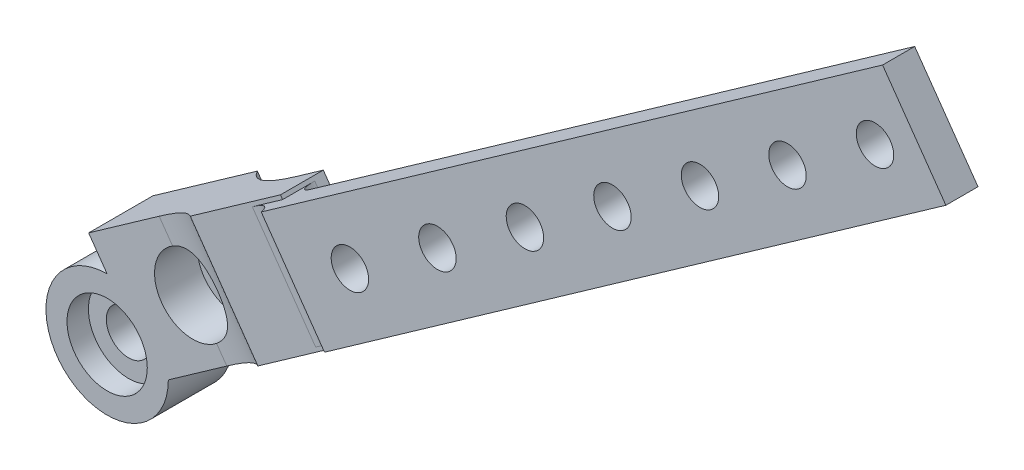
ISO-10303-21;
HEADER;
FILE_DESCRIPTION(('STEP AP214'),'2;1');
FILE_NAME('part.step','',(''),(''),'','','');
FILE_SCHEMA(('AUTOMOTIVE_DESIGN { 1 0 10303 214 1 1 1 1 }'));
ENDSEC;
DATA;
#1=APPLICATION_CONTEXT('core data for automotive mechanical design processes');
#2=APPLICATION_PROTOCOL_DEFINITION('international standard','automotive_design',2000,#1);
#3=PRODUCT_CONTEXT('',#1,'mechanical');
#4=PRODUCT('Part','Part','',(#3));
#5=PRODUCT_RELATED_PRODUCT_CATEGORY('part','',(#4));
#6=PRODUCT_DEFINITION_FORMATION('','',#4);
#7=PRODUCT_DEFINITION_CONTEXT('part definition',#1,'design');
#8=PRODUCT_DEFINITION('design','',#6,#7);
#9=PRODUCT_DEFINITION_SHAPE('','',#8);
#10=(LENGTH_UNIT() NAMED_UNIT(*) SI_UNIT(.MILLI.,.METRE.));
#11=(NAMED_UNIT(*) PLANE_ANGLE_UNIT() SI_UNIT($,.RADIAN.));
#12=(NAMED_UNIT(*) SI_UNIT($,.STERADIAN.) SOLID_ANGLE_UNIT());
#13=UNCERTAINTY_MEASURE_WITH_UNIT(LENGTH_MEASURE(1.E-05),#10,'distance_accuracy_value','');
#14=(GEOMETRIC_REPRESENTATION_CONTEXT(3) GLOBAL_UNCERTAINTY_ASSIGNED_CONTEXT((#13)) GLOBAL_UNIT_ASSIGNED_CONTEXT((#10,
#11,#12)) REPRESENTATION_CONTEXT('',''));
#15=CARTESIAN_POINT('',(0.,0.,0.));
#16=DIRECTION('',(0.,0.,1.));
#17=DIRECTION('',(1.,0.,0.));
#18=AXIS2_PLACEMENT_3D('',#15,#16,#17);
#19=CARTESIAN_POINT('',(0.,0.,3.));
#20=DIRECTION('',(0.,0.,1.));
#21=DIRECTION('',(1.,0.,0.));
#22=AXIS2_PLACEMENT_3D('',#19,#20,#21);
#23=PLANE('',#22);
#24=CARTESIAN_POINT('',(26.6749948851273,21.4820498186249,3.));
#25=DIRECTION('',(0.,0.,1.));
#26=DIRECTION('',(1.,0.,0.));
#27=AXIS2_PLACEMENT_3D('',#24,#25,#26);
#28=CIRCLE('',#27,1.75);
#29=CARTESIAN_POINT('',(28.4249948851273,21.4820498186249,3.));
#30=VERTEX_POINT('',#29);
#31=EDGE_CURVE('E328',#30,#30,#28,.T.);
#32=ORIENTED_EDGE('',*,*,#31,.T.);
#33=EDGE_LOOP('',(#32));
#34=FACE_BOUND('',#33,.T.);
#35=CARTESIAN_POINT('',(34.8489332584846,27.2428424262925,3.));
#36=DIRECTION('',(0.,0.,1.));
#37=DIRECTION('',(1.,0.,0.));
#38=AXIS2_PLACEMENT_3D('',#35,#36,#37);
#39=CIRCLE('',#38,1.75);
#40=CARTESIAN_POINT('',(36.5989332584846,27.2428424262925,3.));
#41=VERTEX_POINT('',#40);
#42=EDGE_CURVE('E333',#41,#41,#39,.T.);
#43=ORIENTED_EDGE('',*,*,#42,.T.);
#44=EDGE_LOOP('',(#43));
#45=FACE_BOUND('',#44,.T.);
#46=CARTESIAN_POINT('',(43.0228716318418,33.00363503396,3.));
#47=DIRECTION('',(0.,0.,1.));
#48=DIRECTION('',(1.,0.,0.));
#49=AXIS2_PLACEMENT_3D('',#46,#47,#48);
#50=CIRCLE('',#49,1.75);
#51=CARTESIAN_POINT('',(44.7728716318419,33.00363503396,3.));
#52=VERTEX_POINT('',#51);
#53=EDGE_CURVE('E335',#52,#52,#50,.T.);
#54=ORIENTED_EDGE('',*,*,#53,.T.);
#55=EDGE_LOOP('',(#54));
#56=FACE_BOUND('',#55,.T.);
#57=CARTESIAN_POINT('',(51.1968100051991,38.7644276416276,3.));
#58=DIRECTION('',(0.,0.,1.));
#59=DIRECTION('',(1.,0.,0.));
#60=AXIS2_PLACEMENT_3D('',#57,#58,#59);
#61=CIRCLE('',#60,1.75);
#62=CARTESIAN_POINT('',(52.9468100051991,38.7644276416276,3.));
#63=VERTEX_POINT('',#62);
#64=EDGE_CURVE('E340',#63,#63,#61,.T.);
#65=ORIENTED_EDGE('',*,*,#64,.T.);
#66=EDGE_LOOP('',(#65));
#67=FACE_BOUND('',#66,.T.);
#68=CARTESIAN_POINT('',(59.3707483785564,44.5252202492952,3.));
#69=DIRECTION('',(0.,0.,1.));
#70=DIRECTION('',(1.,0.,0.));
#71=AXIS2_PLACEMENT_3D('',#68,#69,#70);
#72=CIRCLE('',#71,1.75);
#73=CARTESIAN_POINT('',(61.1207483785564,44.5252202492952,3.));
#74=VERTEX_POINT('',#73);
#75=EDGE_CURVE('E337',#74,#74,#72,.T.);
#76=ORIENTED_EDGE('',*,*,#75,.T.);
#77=EDGE_LOOP('',(#76));
#78=FACE_BOUND('',#77,.T.);
#79=CARTESIAN_POINT('',(67.5446867519137,50.2860128569627,3.));
#80=DIRECTION('',(0.,0.,1.));
#81=DIRECTION('',(1.,0.,0.));
#82=AXIS2_PLACEMENT_3D('',#79,#80,#81);
#83=CIRCLE('',#82,1.75000000000001);
#84=CARTESIAN_POINT('',(69.2946867519137,50.2860128569627,3.));
#85=VERTEX_POINT('',#84);
#86=EDGE_CURVE('E343',#85,#85,#83,.T.);
#87=ORIENTED_EDGE('',*,*,#86,.T.);
#88=EDGE_LOOP('',(#87));
#89=FACE_BOUND('',#88,.T.);
#90=CARTESIAN_POINT('',(75.718625125271,56.0468054646303,3.));
#91=DIRECTION('',(0.,0.,1.));
#92=DIRECTION('',(1.,0.,0.));
#93=AXIS2_PLACEMENT_3D('',#90,#91,#92);
#94=CIRCLE('',#93,1.75000000000001);
#95=CARTESIAN_POINT('',(77.468625125271,56.0468054646303,3.));
#96=VERTEX_POINT('',#95);
#97=EDGE_CURVE('E346',#96,#96,#94,.T.);
#98=ORIENTED_EDGE('',*,*,#97,.T.);
#99=EDGE_LOOP('',(#98));
#100=FACE_BOUND('',#99,.T.);
#101=DIRECTION('',(-0.81737705829948,-0.576103067658634,0.));
#102=VECTOR('',#101,1.);
#103=CARTESIAN_POINT('',(1.695174232095,-2.40511916169124,3.));
#104=LINE('',#103,#102);
#105=CARTESIAN_POINT('',(82.3379002181802,54.4334247553516,3.));
#106=VERTEX_POINT('',#105);
#107=CARTESIAN_POINT('',(25.938883195516,14.6823130869058,3.));
#108=VERTEX_POINT('',#107);
#109=EDGE_CURVE('E321',#106,#108,#104,.T.);
#110=ORIENTED_EDGE('',*,*,#109,.T.);
#111=DIRECTION('',(0.576103067658632,-0.817377058299481,0.));
#112=VECTOR('',#111,1.);
#113=CARTESIAN_POINT('',(24.243708963421,17.087432248597,3.));
#114=LINE('',#113,#112);
#115=CARTESIAN_POINT('',(20.0258347020298,23.0717670830992,3.));
#116=VERTEX_POINT('',#115);
#117=EDGE_CURVE('E374',#108,#116,#114,.F.);
#118=ORIENTED_EDGE('',*,*,#117,.T.);
#119=DIRECTION('',(0.817377058299481,0.576103067658633,0.));
#120=VECTOR('',#119,1.);
#121=CARTESIAN_POINT('',(-4.21787426139126,5.98433483450211,3.));
#122=LINE('',#121,#120);
#123=CARTESIAN_POINT('',(76.424851724694,62.8228787515448,3.));
#124=VERTEX_POINT('',#123);
#125=EDGE_CURVE('E324',#116,#124,#122,.T.);
#126=ORIENTED_EDGE('',*,*,#125,.T.);
#127=DIRECTION('',(-0.576103067658632,0.817377058299481,0.));
#128=VECTOR('',#127,1.);
#129=CARTESIAN_POINT('',(82.5395362918607,54.1473427849467,3.));
#130=LINE('',#129,#128);
#131=EDGE_CURVE('E347',#106,#124,#130,.T.);
#132=ORIENTED_EDGE('',*,*,#131,.F.);
#133=EDGE_LOOP('',(#110,#118,#126,#132));
#134=FACE_BOUND('',#133,.T.);
#135=ADVANCED_FACE('F44',(#34,#45,#56,#67,#78,#89,#100,#134),#23,.F.);
#136=CARTESIAN_POINT('',(80.6427259860853,56.8385439170427,3.));
#137=DIRECTION('',(0.817377058299481,0.576103067658632,0.));
#138=DIRECTION('',(-0.576103067658632,0.817377058299481,0.));
#139=AXIS2_PLACEMENT_3D('',#136,#137,#138);
#140=PLANE('',#139);
#141=ORIENTED_EDGE('',*,*,#131,.T.);
#142=DIRECTION('',(0.,0.,1.));
#143=VECTOR('',#142,1.);
#144=CARTESIAN_POINT('',(76.424851724694,62.8228787515448,-5.));
#145=LINE('',#144,#143);
#146=CARTESIAN_POINT('',(76.424851724694,62.8228787515448,6.));
#147=VERTEX_POINT('',#146);
#148=EDGE_CURVE('E353',#124,#147,#145,.T.);
#149=ORIENTED_EDGE('',*,*,#148,.T.);
#150=DIRECTION('',(0.576103067658632,-0.817377058299481,0.));
#151=VECTOR('',#150,1.);
#152=CARTESIAN_POINT('',(76.424851724694,62.8228787515448,6.));
#153=LINE('',#152,#151);
#154=CARTESIAN_POINT('',(82.3379002181802,54.4334247553515,6.));
#155=VERTEX_POINT('',#154);
#156=EDGE_CURVE('E304',#147,#155,#153,.T.);
#157=ORIENTED_EDGE('',*,*,#156,.T.);
#158=DIRECTION('',(0.,0.,1.));
#159=VECTOR('',#158,1.);
#160=CARTESIAN_POINT('',(82.3379002181802,54.4334247553516,-5.));
#161=LINE('',#160,#159);
#162=EDGE_CURVE('E355',#106,#155,#161,.T.);
#163=ORIENTED_EDGE('',*,*,#162,.F.);
#164=EDGE_LOOP('',(#141,#149,#157,#163));
#165=FACE_BOUND('',#164,.T.);
#166=ADVANCED_FACE('F396',(#165),#140,.T.);
#167=CARTESIAN_POINT('',(82.3379002181802,54.4334247553516,-5.));
#168=DIRECTION('',(-0.576103067658634,0.81737705829948,0.));
#169=DIRECTION('',(-0.81737705829948,-0.576103067658634,0.));
#170=AXIS2_PLACEMENT_3D('',#167,#168,#169);
#171=PLANE('',#170);
#172=ORIENTED_EDGE('',*,*,#162,.T.);
#173=DIRECTION('',(0.817377058299481,0.576103067658632,0.));
#174=VECTOR('',#173,1.);
#175=CARTESIAN_POINT('',(22.6693749623181,12.3779008162713,6.));
#176=LINE('',#175,#174);
#177=CARTESIAN_POINT('',(24.304129078917,13.5301069515886,6.));
#178=VERTEX_POINT('',#177);
#179=EDGE_CURVE('E358',#178,#155,#176,.T.);
#180=ORIENTED_EDGE('',*,*,#179,.F.);
#181=CARTESIAN_POINT('',(21.4726518910853,11.5344273844265,8.));
#182=DIRECTION('',(-0.576103067658634,0.81737705829948,0.));
#183=DIRECTION('',(-0.81737705829948,-0.576103067658634,0.));
#184=AXIS2_PLACEMENT_3D('',#181,#182,#183);
#185=CIRCLE('',#184,4.);
#186=CARTESIAN_POINT('',(21.4726518910853,11.5344273844265,4.));
#187=VERTEX_POINT('',#186);
#188=EDGE_CURVE('E52',#178,#187,#185,.T.);
#189=ORIENTED_EDGE('',*,*,#188,.T.);
#190=DIRECTION('',(-0.81737705829948,-0.576103067658634,0.));
#191=VECTOR('',#190,1.);
#192=CARTESIAN_POINT('',(1.695174232095,-2.40511916169124,4.));
#193=LINE('',#192,#191);
#194=CARTESIAN_POINT('',(24.304129078917,13.5301069515886,4.));
#195=VERTEX_POINT('',#194);
#196=EDGE_CURVE('E58',#195,#187,#193,.T.);
#197=ORIENTED_EDGE('',*,*,#196,.F.);
#198=DIRECTION('',(0.,0.,1.));
#199=VECTOR('',#198,1.);
#200=CARTESIAN_POINT('',(24.304129078917,13.5301069515886,-5.));
#201=LINE('',#200,#199);
#202=CARTESIAN_POINT('',(24.304129078917,13.5301069515886,1.));
#203=VERTEX_POINT('',#202);
#204=EDGE_CURVE('E196',#203,#195,#201,.T.);
#205=ORIENTED_EDGE('',*,*,#204,.F.);
#206=CARTESIAN_POINT('',(25.938883195516,14.6823130869058,1.));
#207=DIRECTION('',(-0.576103067658634,0.81737705829948,0.));
#208=DIRECTION('',(-0.81737705829948,-0.576103067658634,0.));
#209=AXIS2_PLACEMENT_3D('',#206,#207,#208);
#210=CIRCLE('',#209,2.);
#211=EDGE_CURVE('E371',#203,#108,#210,.T.);
#212=ORIENTED_EDGE('',*,*,#211,.T.);
#213=ORIENTED_EDGE('',*,*,#109,.F.);
#214=EDGE_LOOP('',(#172,#180,#189,#197,#205,#212,#213));
#215=FACE_BOUND('',#214,.T.);
#216=ADVANCED_FACE('F484',(#215),#171,.F.);
#217=CARTESIAN_POINT('',(76.424851724694,62.8228787515448,-5.));
#218=DIRECTION('',(0.576103067658633,-0.817377058299481,0.));
#219=DIRECTION('',(0.817377058299481,0.576103067658633,0.));
#220=AXIS2_PLACEMENT_3D('',#217,#218,#219);
#221=PLANE('',#220);
#222=DIRECTION('',(0.,0.,1.));
#223=VECTOR('',#222,1.);
#224=CARTESIAN_POINT('',(18.3910805854308,21.9195609477819,-5.));
#225=LINE('',#224,#223);
#226=CARTESIAN_POINT('',(18.3910805854308,21.9195609477819,1.));
#227=VERTEX_POINT('',#226);
#228=CARTESIAN_POINT('',(18.3910805854308,21.9195609477819,4.));
#229=VERTEX_POINT('',#228);
#230=EDGE_CURVE('E357',#227,#229,#225,.T.);
#231=ORIENTED_EDGE('',*,*,#230,.T.);
#232=DIRECTION('',(0.817377058299481,0.576103067658633,0.));
#233=VECTOR('',#232,1.);
#234=CARTESIAN_POINT('',(-4.21787426139126,5.98433483450211,4.));
#235=LINE('',#234,#233);
#236=CARTESIAN_POINT('',(15.559603397599,19.9238813806198,4.));
#237=VERTEX_POINT('',#236);
#238=EDGE_CURVE('E376',#237,#229,#235,.T.);
#239=ORIENTED_EDGE('',*,*,#238,.F.);
#240=CARTESIAN_POINT('',(15.559603397599,19.9238813806198,8.));
#241=DIRECTION('',(0.576103067658633,-0.817377058299481,0.));
#242=DIRECTION('',(0.817377058299481,0.576103067658633,0.));
#243=AXIS2_PLACEMENT_3D('',#240,#241,#242);
#244=CIRCLE('',#243,4.);
#245=CARTESIAN_POINT('',(18.3910805854308,21.9195609477819,6.));
#246=VERTEX_POINT('',#245);
#247=EDGE_CURVE('E11',#237,#246,#244,.T.);
#248=ORIENTED_EDGE('',*,*,#247,.T.);
#249=DIRECTION('',(0.817377058299481,0.576103067658632,0.));
#250=VECTOR('',#249,1.);
#251=CARTESIAN_POINT('',(16.7563264688319,20.7673548124646,6.));
#252=LINE('',#251,#250);
#253=EDGE_CURVE('E360',#246,#147,#252,.T.);
#254=ORIENTED_EDGE('',*,*,#253,.T.);
#255=ORIENTED_EDGE('',*,*,#148,.F.);
#256=ORIENTED_EDGE('',*,*,#125,.F.);
#257=CARTESIAN_POINT('',(20.0258347020298,23.0717670830992,1.));
#258=DIRECTION('',(0.576103067658633,-0.817377058299481,0.));
#259=DIRECTION('',(0.817377058299481,0.576103067658633,0.));
#260=AXIS2_PLACEMENT_3D('',#257,#258,#259);
#261=CIRCLE('',#260,2.);
#262=EDGE_CURVE('E377',#116,#227,#261,.T.);
#263=ORIENTED_EDGE('',*,*,#262,.T.);
#264=EDGE_LOOP('',(#231,#239,#248,#254,#255,#256,#263));
#265=FACE_BOUND('',#264,.T.);
#266=ADVANCED_FACE('F391',(#265),#221,.F.);
#267=CARTESIAN_POINT('',(67.5446867519137,50.2860128569627,-65.));
#268=DIRECTION('',(0.,0.,1.));
#269=DIRECTION('',(1.,0.,0.));
#270=AXIS2_PLACEMENT_3D('',#267,#268,#269);
#271=CYLINDRICAL_SURFACE('',#270,1.75000000000001);
#272=ORIENTED_EDGE('',*,*,#86,.F.);
#273=EDGE_LOOP('',(#272));
#274=FACE_BOUND('',#273,.T.);
#275=CARTESIAN_POINT('',(67.5446867519137,50.2860128569627,6.));
#276=DIRECTION('',(0.,0.,1.));
#277=DIRECTION('',(0.,-1.,0.));
#278=AXIS2_PLACEMENT_3D('',#275,#276,#277);
#279=CIRCLE('',#278,1.75000000000001);
#280=CARTESIAN_POINT('',(67.5446867519137,48.5360128569627,6.));
#281=VERTEX_POINT('',#280);
#282=EDGE_CURVE('E320',#281,#281,#279,.T.);
#283=ORIENTED_EDGE('',*,*,#282,.T.);
#284=EDGE_LOOP('',(#283));
#285=FACE_BOUND('',#284,.T.);
#286=ADVANCED_FACE('F520',(#274,#285),#271,.F.);
#287=CARTESIAN_POINT('',(75.718625125271,56.0468054646303,-65.));
#288=DIRECTION('',(0.,0.,1.));
#289=DIRECTION('',(1.,0.,0.));
#290=AXIS2_PLACEMENT_3D('',#287,#288,#289);
#291=CYLINDRICAL_SURFACE('',#290,1.75000000000001);
#292=ORIENTED_EDGE('',*,*,#97,.F.);
#293=EDGE_LOOP('',(#292));
#294=FACE_BOUND('',#293,.T.);
#295=CARTESIAN_POINT('',(75.718625125271,56.0468054646303,6.));
#296=DIRECTION('',(0.,0.,1.));
#297=DIRECTION('',(0.,-1.,0.));
#298=AXIS2_PLACEMENT_3D('',#295,#296,#297);
#299=CIRCLE('',#298,1.75000000000001);
#300=CARTESIAN_POINT('',(75.718625125271,54.2968054646303,6.));
#301=VERTEX_POINT('',#300);
#302=EDGE_CURVE('E311',#301,#301,#299,.T.);
#303=ORIENTED_EDGE('',*,*,#302,.T.);
#304=EDGE_LOOP('',(#303));
#305=FACE_BOUND('',#304,.T.);
#306=ADVANCED_FACE('F548',(#294,#305),#291,.F.);
#307=CARTESIAN_POINT('',(59.3707483785564,44.5252202492952,-65.));
#308=DIRECTION('',(0.,0.,1.));
#309=DIRECTION('',(1.,0.,0.));
#310=AXIS2_PLACEMENT_3D('',#307,#308,#309);
#311=CYLINDRICAL_SURFACE('',#310,1.75);
#312=ORIENTED_EDGE('',*,*,#75,.F.);
#313=EDGE_LOOP('',(#312));
#314=FACE_BOUND('',#313,.T.);
#315=CARTESIAN_POINT('',(59.3707483785564,44.5252202492952,6.));
#316=DIRECTION('',(0.,0.,1.));
#317=DIRECTION('',(0.,-1.,0.));
#318=AXIS2_PLACEMENT_3D('',#315,#316,#317);
#319=CIRCLE('',#318,1.75);
#320=CARTESIAN_POINT('',(59.3707483785564,42.7752202492952,6.));
#321=VERTEX_POINT('',#320);
#322=EDGE_CURVE('E314',#321,#321,#319,.T.);
#323=ORIENTED_EDGE('',*,*,#322,.T.);
#324=EDGE_LOOP('',(#323));
#325=FACE_BOUND('',#324,.T.);
#326=ADVANCED_FACE('F542',(#314,#325),#311,.F.);
#327=CARTESIAN_POINT('',(51.1968100051991,38.7644276416276,-65.));
#328=DIRECTION('',(0.,0.,1.));
#329=DIRECTION('',(1.,0.,0.));
#330=AXIS2_PLACEMENT_3D('',#327,#328,#329);
#331=CYLINDRICAL_SURFACE('',#330,1.75);
#332=ORIENTED_EDGE('',*,*,#64,.F.);
#333=EDGE_LOOP('',(#332));
#334=FACE_BOUND('',#333,.T.);
#335=CARTESIAN_POINT('',(51.1968100051991,38.7644276416276,6.));
#336=DIRECTION('',(0.,0.,1.));
#337=DIRECTION('',(0.,-1.,0.));
#338=AXIS2_PLACEMENT_3D('',#335,#336,#337);
#339=CIRCLE('',#338,1.75);
#340=CARTESIAN_POINT('',(51.1968100051991,37.0144276416276,6.));
#341=VERTEX_POINT('',#340);
#342=EDGE_CURVE('E309',#341,#341,#339,.T.);
#343=ORIENTED_EDGE('',*,*,#342,.T.);
#344=EDGE_LOOP('',(#343));
#345=FACE_BOUND('',#344,.T.);
#346=ADVANCED_FACE('F546',(#334,#345),#331,.F.);
#347=CARTESIAN_POINT('',(43.0228716318418,33.00363503396,-65.));
#348=DIRECTION('',(0.,0.,1.));
#349=DIRECTION('',(1.,0.,0.));
#350=AXIS2_PLACEMENT_3D('',#347,#348,#349);
#351=CYLINDRICAL_SURFACE('',#350,1.75);
#352=ORIENTED_EDGE('',*,*,#53,.F.);
#353=EDGE_LOOP('',(#352));
#354=FACE_BOUND('',#353,.T.);
#355=CARTESIAN_POINT('',(43.0228716318418,33.00363503396,6.));
#356=DIRECTION('',(0.,0.,1.));
#357=DIRECTION('',(0.,-1.,0.));
#358=AXIS2_PLACEMENT_3D('',#355,#356,#357);
#359=CIRCLE('',#358,1.75);
#360=CARTESIAN_POINT('',(43.0228716318418,31.25363503396,6.));
#361=VERTEX_POINT('',#360);
#362=EDGE_CURVE('E307',#361,#361,#359,.T.);
#363=ORIENTED_EDGE('',*,*,#362,.T.);
#364=EDGE_LOOP('',(#363));
#365=FACE_BOUND('',#364,.T.);
#366=ADVANCED_FACE('F560',(#354,#365),#351,.F.);
#367=CARTESIAN_POINT('',(34.8489332584846,27.2428424262925,-65.));
#368=DIRECTION('',(0.,0.,1.));
#369=DIRECTION('',(1.,0.,0.));
#370=AXIS2_PLACEMENT_3D('',#367,#368,#369);
#371=CYLINDRICAL_SURFACE('',#370,1.75);
#372=ORIENTED_EDGE('',*,*,#42,.F.);
#373=EDGE_LOOP('',(#372));
#374=FACE_BOUND('',#373,.T.);
#375=CARTESIAN_POINT('',(34.8489332584846,27.2428424262925,6.));
#376=DIRECTION('',(0.,0.,1.));
#377=DIRECTION('',(0.,-1.,0.));
#378=AXIS2_PLACEMENT_3D('',#375,#376,#377);
#379=CIRCLE('',#378,1.75);
#380=CARTESIAN_POINT('',(34.8489332584846,25.4928424262925,6.));
#381=VERTEX_POINT('',#380);
#382=EDGE_CURVE('E305',#381,#381,#379,.T.);
#383=ORIENTED_EDGE('',*,*,#382,.T.);
#384=EDGE_LOOP('',(#383));
#385=FACE_BOUND('',#384,.T.);
#386=ADVANCED_FACE('F568',(#374,#385),#371,.F.);
#387=CARTESIAN_POINT('',(26.6749948851273,21.4820498186249,-65.));
#388=DIRECTION('',(0.,0.,1.));
#389=DIRECTION('',(1.,0.,0.));
#390=AXIS2_PLACEMENT_3D('',#387,#388,#389);
#391=CYLINDRICAL_SURFACE('',#390,1.75);
#392=ORIENTED_EDGE('',*,*,#31,.F.);
#393=EDGE_LOOP('',(#392));
#394=FACE_BOUND('',#393,.T.);
#395=CARTESIAN_POINT('',(26.6749948851273,21.4820498186249,6.));
#396=DIRECTION('',(0.,0.,1.));
#397=DIRECTION('',(0.,-1.,0.));
#398=AXIS2_PLACEMENT_3D('',#395,#396,#397);
#399=CIRCLE('',#398,1.75);
#400=CARTESIAN_POINT('',(26.6749948851273,19.7320498186249,6.));
#401=VERTEX_POINT('',#400);
#402=EDGE_CURVE('E296',#401,#401,#399,.T.);
#403=ORIENTED_EDGE('',*,*,#402,.T.);
#404=EDGE_LOOP('',(#403));
#405=FACE_BOUND('',#404,.T.);
#406=ADVANCED_FACE('F513',(#394,#405),#391,.F.);
#407=CARTESIAN_POINT('',(16.7563264688319,20.7673548124646,6.));
#408=DIRECTION('',(0.,0.,1.));
#409=DIRECTION('',(0.,-1.,0.));
#410=AXIS2_PLACEMENT_3D('',#407,#408,#409);
#411=PLANE('',#410);
#412=ORIENTED_EDGE('',*,*,#402,.F.);
#413=EDGE_LOOP('',(#412));
#414=FACE_BOUND('',#413,.T.);
#415=ORIENTED_EDGE('',*,*,#382,.F.);
#416=EDGE_LOOP('',(#415));
#417=FACE_BOUND('',#416,.T.);
#418=ORIENTED_EDGE('',*,*,#362,.F.);
#419=EDGE_LOOP('',(#418));
#420=FACE_BOUND('',#419,.T.);
#421=ORIENTED_EDGE('',*,*,#342,.F.);
#422=EDGE_LOOP('',(#421));
#423=FACE_BOUND('',#422,.T.);
#424=ORIENTED_EDGE('',*,*,#322,.F.);
#425=EDGE_LOOP('',(#424));
#426=FACE_BOUND('',#425,.T.);
#427=ORIENTED_EDGE('',*,*,#302,.F.);
#428=EDGE_LOOP('',(#427));
#429=FACE_BOUND('',#428,.T.);
#430=ORIENTED_EDGE('',*,*,#282,.F.);
#431=EDGE_LOOP('',(#430));
#432=FACE_BOUND('',#431,.T.);
#433=ORIENTED_EDGE('',*,*,#253,.F.);
#434=DIRECTION('',(0.576103067658632,-0.817377058299481,0.));
#435=VECTOR('',#434,1.);
#436=CARTESIAN_POINT('',(22.6089548468221,15.9352261132798,6.));
#437=LINE('',#436,#435);
#438=EDGE_CURVE('E323',#246,#178,#437,.T.);
#439=ORIENTED_EDGE('',*,*,#438,.T.);
#440=ORIENTED_EDGE('',*,*,#179,.T.);
#441=ORIENTED_EDGE('',*,*,#156,.F.);
#442=EDGE_LOOP('',(#433,#439,#440,#441));
#443=FACE_BOUND('',#442,.T.);
#444=ADVANCED_FACE('F397',(#414,#417,#420,#423,#426,#429,#432,#443),#411,.T.);
#445=CARTESIAN_POINT('',(22.6089548468221,15.9352261132798,0.));
#446=DIRECTION('',(0.817377058299481,0.576103067658632,0.));
#447=DIRECTION('',(-0.576103067658632,0.817377058299481,0.));
#448=AXIS2_PLACEMENT_3D('',#445,#446,#447);
#449=PLANE('',#448);
#450=DIRECTION('',(0.576103067658632,-0.817377058299481,0.));
#451=VECTOR('',#450,1.);
#452=CARTESIAN_POINT('',(22.6089548468221,15.9352261132798,1.));
#453=LINE('',#452,#451);
#454=EDGE_CURVE('E322',#227,#203,#453,.T.);
#455=ORIENTED_EDGE('',*,*,#454,.T.);
#456=ORIENTED_EDGE('',*,*,#204,.T.);
#457=DIRECTION('',(0.576103067658632,-0.817377058299481,0.));
#458=VECTOR('',#457,1.);
#459=CARTESIAN_POINT('',(24.5057651525976,13.2440249811838,4.));
#460=LINE('',#459,#458);
#461=CARTESIAN_POINT('',(24.5057651525976,13.2440249811838,4.));
#462=VERTEX_POINT('',#461);
#463=EDGE_CURVE('E207',#195,#462,#460,.T.);
#464=ORIENTED_EDGE('',*,*,#463,.T.);
#465=DIRECTION('',(0.,0.,-1.));
#466=VECTOR('',#465,1.);
#467=CARTESIAN_POINT('',(24.5057651525976,13.2440249811838,2.));
#468=LINE('',#467,#466);
#469=CARTESIAN_POINT('',(24.5057651525976,13.2440249811838,0.));
#470=VERTEX_POINT('',#469);
#471=EDGE_CURVE('E191',#462,#470,#468,.T.);
#472=ORIENTED_EDGE('',*,*,#471,.T.);
#473=DIRECTION('',(0.576103067658625,-0.817377058299486,0.));
#474=VECTOR('',#473,1.);
#475=CARTESIAN_POINT('',(22.6089548468222,15.9352261132796,0.));
#476=LINE('',#475,#474);
#477=CARTESIAN_POINT('',(18.1894445117503,22.2056429181867,0.));
#478=VERTEX_POINT('',#477);
#479=EDGE_CURVE('E181',#478,#470,#476,.T.);
#480=ORIENTED_EDGE('',*,*,#479,.F.);
#481=DIRECTION('',(0.,0.,1.));
#482=VECTOR('',#481,1.);
#483=CARTESIAN_POINT('',(18.1894445117503,22.2056429181867,2.));
#484=LINE('',#483,#482);
#485=CARTESIAN_POINT('',(18.1894445117503,22.2056429181867,4.));
#486=VERTEX_POINT('',#485);
#487=EDGE_CURVE('E186',#478,#486,#484,.T.);
#488=ORIENTED_EDGE('',*,*,#487,.T.);
#489=EDGE_CURVE('E410',#486,#229,#460,.T.);
#490=ORIENTED_EDGE('',*,*,#489,.T.);
#491=ORIENTED_EDGE('',*,*,#230,.F.);
#492=EDGE_LOOP('',(#455,#456,#464,#472,#480,#488,#490,#491));
#493=FACE_BOUND('',#492,.T.);
#494=ADVANCED_FACE('F188',(#493),#449,.T.);
#495=CARTESIAN_POINT('',(-1.72830920297589,8.16722711068241,2.));
#496=DIRECTION('',(0.576103067658631,-0.817377058299482,0.));
#497=DIRECTION('',(0.817377058299482,0.576103067658631,0.));
#498=AXIS2_PLACEMENT_3D('',#495,#496,#497);
#499=PLANE('',#498);
#500=ORIENTED_EDGE('',*,*,#487,.F.);
#501=DIRECTION('',(-0.817377058299482,-0.576103067658631,0.));
#502=VECTOR('',#501,1.);
#503=CARTESIAN_POINT('',(-1.72830920297589,8.16722711068241,0.));
#504=LINE('',#503,#502);
#505=CARTESIAN_POINT('',(15.6995592923545,20.4507239386939,0.));
#506=VERTEX_POINT('',#505);
#507=EDGE_CURVE('E205',#478,#506,#504,.T.);
#508=ORIENTED_EDGE('',*,*,#507,.T.);
#509=CARTESIAN_POINT('',(15.6995592923545,20.4507239386939,-13.));
#510=DIRECTION('',(0.576103067658631,-0.817377058299482,0.));
#511=DIRECTION('',(0.817377058299482,0.576103067658631,0.));
#512=AXIS2_PLACEMENT_3D('',#509,#510,#511);
#513=CIRCLE('',#512,13.);
#514=CARTESIAN_POINT('',(8.03188282042254,15.0463981230366,-4.));
#515=VERTEX_POINT('',#514);
#516=EDGE_CURVE('E214',#506,#515,#513,.T.);
#517=ORIENTED_EDGE('',*,*,#516,.T.);
#518=DIRECTION('',(0.817377058299483,0.576103067658629,0.));
#519=VECTOR('',#518,1.);
#520=CARTESIAN_POINT('',(-1.72830920297589,8.16722711068241,-4.));
#521=LINE('',#520,#519);
#522=CARTESIAN_POINT('',(-1.72830920297589,8.16722711068241,-4.));
#523=VERTEX_POINT('',#522);
#524=EDGE_CURVE('E267',#523,#515,#521,.T.);
#525=ORIENTED_EDGE('',*,*,#524,.F.);
#526=DIRECTION('',(0.,0.,-1.));
#527=VECTOR('',#526,1.);
#528=CARTESIAN_POINT('',(-1.72830920297589,8.16722711068241,2.));
#529=LINE('',#528,#527);
#530=CARTESIAN_POINT('',(-1.72830920297589,8.16722711068241,2.));
#531=VERTEX_POINT('',#530);
#532=EDGE_CURVE('E414',#531,#523,#529,.T.);
#533=ORIENTED_EDGE('',*,*,#532,.F.);
#534=DIRECTION('',(-0.817377058299482,-0.576103067658631,0.));
#535=VECTOR('',#534,1.);
#536=CARTESIAN_POINT('',(-1.72830920297589,8.16722711068241,2.));
#537=LINE('',#536,#535);
#538=CARTESIAN_POINT('',(4.85947159707791,12.8104216919806,2.));
#539=VERTEX_POINT('',#538);
#540=EDGE_CURVE('E227',#539,#531,#537,.T.);
#541=ORIENTED_EDGE('',*,*,#540,.F.);
#542=CARTESIAN_POINT('',(4.85947159707791,12.8104216919806,12.));
#543=DIRECTION('',(0.576103067658631,-0.817377058299482,0.));
#544=DIRECTION('',(0.817377058299482,0.576103067658631,0.));
#545=AXIS2_PLACEMENT_3D('',#542,#543,#544);
#546=CIRCLE('',#545,10.);
#547=CARTESIAN_POINT('',(9.76373394687481,16.2670400979324,4.));
#548=VERTEX_POINT('',#547);
#549=EDGE_CURVE('E211',#539,#548,#546,.T.);
#550=ORIENTED_EDGE('',*,*,#549,.T.);
#551=DIRECTION('',(-0.817377058299482,-0.576103067658631,0.));
#552=VECTOR('',#551,1.);
#553=CARTESIAN_POINT('',(9.76373394687481,16.2670400979324,4.));
#554=LINE('',#553,#552);
#555=EDGE_CURVE('E204',#486,#548,#554,.T.);
#556=ORIENTED_EDGE('',*,*,#555,.F.);
#557=EDGE_LOOP('',(#500,#508,#517,#525,#533,#541,#550,#556));
#558=FACE_BOUND('',#557,.T.);
#559=ADVANCED_FACE('F201',(#558),#499,.F.);
#560=CARTESIAN_POINT('',(15.3411111129398,6.78460059109725,2.));
#561=DIRECTION('',(-0.57610306765863,0.817377058299483,0.));
#562=DIRECTION('',(-0.817377058299483,-0.57610306765863,0.));
#563=AXIS2_PLACEMENT_3D('',#560,#561,#562);
#564=PLANE('',#563);
#565=DIRECTION('',(0.817377058299483,0.57610306765863,0.));
#566=VECTOR('',#565,1.);
#567=CARTESIAN_POINT('',(15.3411111129398,6.78460059109725,0.));
#568=LINE('',#567,#566);
#569=CARTESIAN_POINT('',(22.0158799332018,11.4891060016909,0.));
#570=VERTEX_POINT('',#569);
#571=EDGE_CURVE('E212',#570,#470,#568,.T.);
#572=ORIENTED_EDGE('',*,*,#571,.T.);
#573=ORIENTED_EDGE('',*,*,#471,.F.);
#574=DIRECTION('',(0.817377058299482,0.576103067658631,0.));
#575=VECTOR('',#574,1.);
#576=CARTESIAN_POINT('',(16.080054587722,7.30542216092946,4.));
#577=LINE('',#576,#575);
#578=CARTESIAN_POINT('',(16.080054587722,7.30542216092946,4.));
#579=VERTEX_POINT('',#578);
#580=EDGE_CURVE('E251',#579,#462,#577,.T.);
#581=ORIENTED_EDGE('',*,*,#580,.F.);
#582=CARTESIAN_POINT('',(11.1757922379251,3.84880375497767,12.));
#583=DIRECTION('',(-0.57610306765863,0.817377058299483,0.));
#584=DIRECTION('',(-0.817377058299483,-0.57610306765863,0.));
#585=AXIS2_PLACEMENT_3D('',#582,#583,#584);
#586=CIRCLE('',#585,10.);
#587=CARTESIAN_POINT('',(11.1757922379251,3.84880375497768,2.));
#588=VERTEX_POINT('',#587);
#589=EDGE_CURVE('E423',#579,#588,#586,.T.);
#590=ORIENTED_EDGE('',*,*,#589,.T.);
#591=DIRECTION('',(0.817377058299484,0.576103067658628,0.));
#592=VECTOR('',#591,1.);
#593=CARTESIAN_POINT('',(5.71509593578396,0.,2.));
#594=LINE('',#593,#592);
#595=CARTESIAN_POINT('',(5.71509593578396,0.,2.));
#596=VERTEX_POINT('',#595);
#597=EDGE_CURVE('E226',#596,#588,#594,.T.);
#598=ORIENTED_EDGE('',*,*,#597,.F.);
#599=DIRECTION('',(0.,0.,-1.));
#600=VECTOR('',#599,1.);
#601=CARTESIAN_POINT('',(5.71509593578396,0.,2.));
#602=LINE('',#601,#600);
#603=CARTESIAN_POINT('',(5.71509593578396,0.,-4.));
#604=VERTEX_POINT('',#603);
#605=EDGE_CURVE('E831',#596,#604,#602,.T.);
#606=ORIENTED_EDGE('',*,*,#605,.T.);
#607=DIRECTION('',(-0.817377058299483,-0.576103067658629,0.));
#608=VECTOR('',#607,1.);
#609=CARTESIAN_POINT('',(14.3482034612697,6.08478018603363,-4.));
#610=LINE('',#609,#608);
#611=CARTESIAN_POINT('',(14.3482034612697,6.08478018603363,-4.));
#612=VERTEX_POINT('',#611);
#613=EDGE_CURVE('E264',#612,#604,#610,.T.);
#614=ORIENTED_EDGE('',*,*,#613,.F.);
#615=CARTESIAN_POINT('',(22.0158799332018,11.4891060016909,-13.));
#616=DIRECTION('',(-0.57610306765863,0.817377058299483,0.));
#617=DIRECTION('',(-0.817377058299483,-0.57610306765863,0.));
#618=AXIS2_PLACEMENT_3D('',#615,#616,#617);
#619=CIRCLE('',#618,13.);
#620=EDGE_CURVE('E216',#612,#570,#619,.T.);
#621=ORIENTED_EDGE('',*,*,#620,.T.);
#622=EDGE_LOOP('',(#572,#573,#581,#590,#598,#606,#614,#621));
#623=FACE_BOUND('',#622,.T.);
#624=ADVANCED_FACE('F447',(#623),#564,.F.);
#625=CARTESIAN_POINT('',(0.,0.,0.));
#626=DIRECTION('',(0.,0.,1.));
#627=DIRECTION('',(1.,0.,0.));
#628=AXIS2_PLACEMENT_3D('',#625,#626,#627);
#629=PLANE('',#628);
#630=ORIENTED_EDGE('',*,*,#507,.F.);
#631=ORIENTED_EDGE('',*,*,#479,.T.);
#632=ORIENTED_EDGE('',*,*,#571,.F.);
#633=DIRECTION('',(-0.576103067658629,0.817377058299483,0.));
#634=VECTOR('',#633,1.);
#635=CARTESIAN_POINT('',(20.1190696274264,14.1803071337869,0.));
#636=LINE('',#635,#634);
#637=EDGE_CURVE('E213',#570,#506,#636,.T.);
#638=ORIENTED_EDGE('',*,*,#637,.T.);
#639=EDGE_LOOP('',(#630,#631,#632,#638));
#640=FACE_BOUND('',#639,.T.);
#641=ADVANCED_FACE('F206',(#640),#629,.F.);
#642=CARTESIAN_POINT('',(0.,0.,-2.));
#643=DIRECTION('',(0.,0.,1.));
#644=DIRECTION('',(1.,0.,0.));
#645=AXIS2_PLACEMENT_3D('',#642,#643,#644);
#646=CYLINDRICAL_SURFACE('',#645,2.075);
#647=CARTESIAN_POINT('',(0.,0.,-4.));
#648=DIRECTION('',(0.,0.,-1.));
#649=DIRECTION('',(-1.,0.,0.));
#650=AXIS2_PLACEMENT_3D('',#647,#648,#649);
#651=CIRCLE('',#650,2.075);
#652=CARTESIAN_POINT('',(-2.075,0.,-4.));
#653=VERTEX_POINT('',#652);
#654=EDGE_CURVE('E285',#653,#653,#651,.T.);
#655=ORIENTED_EDGE('',*,*,#654,.T.);
#656=EDGE_LOOP('',(#655));
#657=FACE_BOUND('',#656,.T.);
#658=CARTESIAN_POINT('',(0.,0.,0.));
#659=DIRECTION('',(0.,0.,1.));
#660=DIRECTION('',(1.,0.,0.));
#661=AXIS2_PLACEMENT_3D('',#658,#659,#660);
#662=CIRCLE('',#661,2.075);
#663=CARTESIAN_POINT('',(2.075,0.,0.));
#664=VERTEX_POINT('',#663);
#665=EDGE_CURVE('E297',#664,#664,#662,.F.);
#666=ORIENTED_EDGE('',*,*,#665,.F.);
#667=EDGE_LOOP('',(#666));
#668=FACE_BOUND('',#667,.T.);
#669=ADVANCED_FACE('F459',(#657,#668),#646,.F.);
#670=CARTESIAN_POINT('',(8.48528137423711,8.48528137423782,2.));
#671=DIRECTION('',(0.,0.,-1.));
#672=DIRECTION('',(-1.,0.,0.));
#673=AXIS2_PLACEMENT_3D('',#670,#671,#672);
#674=CYLINDRICAL_SURFACE('',#673,2.);
#675=DIRECTION('',(0.,0.,-1.));
#676=VECTOR('',#675,1.);
#677=CARTESIAN_POINT('',(9.89949493661021,7.07106781186472,2.));
#678=LINE('',#677,#676);
#679=CARTESIAN_POINT('',(9.89949493661021,7.07106781186472,-2.));
#680=VERTEX_POINT('',#679);
#681=CARTESIAN_POINT('',(9.89949493661021,7.07106781186472,-4.));
#682=VERTEX_POINT('',#681);
#683=EDGE_CURVE('E250',#680,#682,#678,.T.);
#684=ORIENTED_EDGE('',*,*,#683,.F.);
#685=CARTESIAN_POINT('',(8.48528137423711,8.48528137423782,-2.));
#686=DIRECTION('',(0.,0.,1.));
#687=DIRECTION('',(1.,0.,0.));
#688=AXIS2_PLACEMENT_3D('',#685,#686,#687);
#689=CIRCLE('',#688,2.);
#690=CARTESIAN_POINT('',(7.07106781186402,9.89949493661091,-2.));
#691=VERTEX_POINT('',#690);
#692=EDGE_CURVE('E240',#680,#691,#689,.T.);
#693=ORIENTED_EDGE('',*,*,#692,.T.);
#694=DIRECTION('',(0.,0.,-1.));
#695=VECTOR('',#694,1.);
#696=CARTESIAN_POINT('',(7.07106781186402,9.89949493661091,2.));
#697=LINE('',#696,#695);
#698=CARTESIAN_POINT('',(7.07106781186402,9.89949493661091,-4.));
#699=VERTEX_POINT('',#698);
#700=EDGE_CURVE('E238',#691,#699,#697,.T.);
#701=ORIENTED_EDGE('',*,*,#700,.T.);
#702=CARTESIAN_POINT('',(8.48528137423711,8.48528137423782,-4.));
#703=DIRECTION('',(0.,0.,-1.));
#704=DIRECTION('',(-1.,0.,0.));
#705=AXIS2_PLACEMENT_3D('',#702,#703,#704);
#706=CIRCLE('',#705,2.);
#707=EDGE_CURVE('E237',#699,#682,#706,.T.);
#708=ORIENTED_EDGE('',*,*,#707,.T.);
#709=EDGE_LOOP('',(#684,#693,#701,#708));
#710=FACE_BOUND('',#709,.T.);
#711=ADVANCED_FACE('F453',(#710),#674,.F.);
#712=CARTESIAN_POINT('',(7.07106781186402,9.89949493661091,2.));
#713=DIRECTION('',(0.707106781186564,-0.707106781186531,0.));
#714=DIRECTION('',(0.707106781186531,0.707106781186564,0.));
#715=AXIS2_PLACEMENT_3D('',#712,#713,#714);
#716=PLANE('',#715);
#717=ORIENTED_EDGE('',*,*,#700,.F.);
#718=DIRECTION('',(-0.707106781186531,-0.707106781186564,0.));
#719=VECTOR('',#718,1.);
#720=CARTESIAN_POINT('',(7.07106781186402,9.89949493661091,-2.));
#721=LINE('',#720,#719);
#722=CARTESIAN_POINT('',(6.58578643762543,9.4142135623723,-2.));
#723=VERTEX_POINT('',#722);
#724=EDGE_CURVE('E245',#691,#723,#721,.T.);
#725=ORIENTED_EDGE('',*,*,#724,.T.);
#726=DIRECTION('',(0.,0.,-1.));
#727=VECTOR('',#726,1.);
#728=CARTESIAN_POINT('',(6.58578643762543,9.4142135623723,2.));
#729=LINE('',#728,#727);
#730=CARTESIAN_POINT('',(6.58578643762543,9.4142135623723,-4.));
#731=VERTEX_POINT('',#730);
#732=EDGE_CURVE('E236',#723,#731,#729,.T.);
#733=ORIENTED_EDGE('',*,*,#732,.T.);
#734=DIRECTION('',(0.707106781186529,0.707106781186566,0.));
#735=VECTOR('',#734,1.);
#736=CARTESIAN_POINT('',(7.07106781186402,9.89949493661091,-4.));
#737=LINE('',#736,#735);
#738=EDGE_CURVE('E241',#731,#699,#737,.T.);
#739=ORIENTED_EDGE('',*,*,#738,.T.);
#740=EDGE_LOOP('',(#717,#725,#733,#739));
#741=FACE_BOUND('',#740,.T.);
#742=ADVANCED_FACE('F456',(#741),#716,.T.);
#743=CARTESIAN_POINT('',(7.99999999999854,7.99999999999922,2.));
#744=DIRECTION('',(0.,0.,-1.));
#745=DIRECTION('',(-1.,0.,0.));
#746=AXIS2_PLACEMENT_3D('',#743,#744,#745);
#747=CYLINDRICAL_SURFACE('',#746,1.99999999999999);
#748=ORIENTED_EDGE('',*,*,#732,.F.);
#749=CARTESIAN_POINT('',(7.99999999999854,7.99999999999922,-2.));
#750=DIRECTION('',(0.,0.,1.));
#751=DIRECTION('',(1.,0.,0.));
#752=AXIS2_PLACEMENT_3D('',#749,#750,#751);
#753=CIRCLE('',#752,1.99999999999999);
#754=CARTESIAN_POINT('',(9.41421356237164,6.58578643762615,-2.));
#755=VERTEX_POINT('',#754);
#756=EDGE_CURVE('E249',#723,#755,#753,.T.);
#757=ORIENTED_EDGE('',*,*,#756,.T.);
#758=DIRECTION('',(0.,0.,-1.));
#759=VECTOR('',#758,1.);
#760=CARTESIAN_POINT('',(9.41421356237164,6.58578643762615,2.));
#761=LINE('',#760,#759);
#762=CARTESIAN_POINT('',(9.41421356237164,6.58578643762615,-4.));
#763=VERTEX_POINT('',#762);
#764=EDGE_CURVE('E243',#755,#763,#761,.T.);
#765=ORIENTED_EDGE('',*,*,#764,.T.);
#766=CARTESIAN_POINT('',(7.99999999999854,7.99999999999922,-4.));
#767=DIRECTION('',(0.,0.,-1.));
#768=DIRECTION('',(-1.,0.,0.));
#769=AXIS2_PLACEMENT_3D('',#766,#767,#768);
#770=CIRCLE('',#769,1.99999999999999);
#771=EDGE_CURVE('E247',#763,#731,#770,.T.);
#772=ORIENTED_EDGE('',*,*,#771,.T.);
#773=EDGE_LOOP('',(#748,#757,#765,#772));
#774=FACE_BOUND('',#773,.T.);
#775=ADVANCED_FACE('F462',(#774),#747,.F.);
#776=CARTESIAN_POINT('',(9.41421356237164,6.58578643762615,2.));
#777=DIRECTION('',(-0.707106781186552,0.707106781186543,0.));
#778=DIRECTION('',(-0.707106781186543,-0.707106781186552,0.));
#779=AXIS2_PLACEMENT_3D('',#776,#777,#778);
#780=PLANE('',#779);
#781=ORIENTED_EDGE('',*,*,#764,.F.);
#782=DIRECTION('',(0.707106781186543,0.707106781186552,0.));
#783=VECTOR('',#782,1.);
#784=CARTESIAN_POINT('',(9.41421356237164,6.58578643762615,-2.));
#785=LINE('',#784,#783);
#786=EDGE_CURVE('E248',#755,#680,#785,.T.);
#787=ORIENTED_EDGE('',*,*,#786,.T.);
#788=ORIENTED_EDGE('',*,*,#683,.T.);
#789=DIRECTION('',(-0.70710678118654,-0.707106781186555,0.));
#790=VECTOR('',#789,1.);
#791=CARTESIAN_POINT('',(9.41421356237164,6.58578643762615,-4.));
#792=LINE('',#791,#790);
#793=EDGE_CURVE('E231',#682,#763,#792,.T.);
#794=ORIENTED_EDGE('',*,*,#793,.T.);
#795=EDGE_LOOP('',(#781,#787,#788,#794));
#796=FACE_BOUND('',#795,.T.);
#797=ADVANCED_FACE('F466',(#796),#780,.T.);
#798=CARTESIAN_POINT('',(0.,0.,2.));
#799=DIRECTION('',(0.,0.,1.));
#800=DIRECTION('',(1.,0.,0.));
#801=AXIS2_PLACEMENT_3D('',#798,#799,#800);
#802=PLANE('',#801);
#803=CARTESIAN_POINT('',(0.,0.,2.));
#804=DIRECTION('',(0.,0.,1.));
#805=DIRECTION('',(1.,0.,0.));
#806=AXIS2_PLACEMENT_3D('',#803,#804,#805);
#807=CIRCLE('',#806,3.75);
#808=CARTESIAN_POINT('',(3.75,0.,2.));
#809=VERTEX_POINT('',#808);
#810=EDGE_CURVE('E200',#809,#809,#807,.T.);
#811=ORIENTED_EDGE('',*,*,#810,.F.);
#812=EDGE_LOOP('',(#811));
#813=FACE_BOUND('',#812,.T.);
#814=ORIENTED_EDGE('',*,*,#597,.T.);
#815=DIRECTION('',(-0.576103067658631,0.817377058299482,0.));
#816=VECTOR('',#815,1.);
#817=CARTESIAN_POINT('',(4.85947159707791,12.8104216919806,2.));
#818=LINE('',#817,#816);
#819=CARTESIAN_POINT('',(10.2212076753053,5.20317168928392,2.));
#820=VERTEX_POINT('',#819);
#821=EDGE_CURVE('E235',#588,#820,#818,.T.);
#822=ORIENTED_EDGE('',*,*,#821,.T.);
#823=CARTESIAN_POINT('',(7.99999999999854,7.99999999999922,2.));
#824=DIRECTION('',(0.,0.,1.));
#825=DIRECTION('',(1.,0.,0.));
#826=AXIS2_PLACEMENT_3D('',#823,#824,#825);
#827=CIRCLE('',#826,3.57155598254602);
#828=CARTESIAN_POINT('',(6.11277721052296,11.0322272802908,2.));
#829=VERTEX_POINT('',#828);
#830=EDGE_CURVE('E425',#829,#820,#827,.T.);
#831=ORIENTED_EDGE('',*,*,#830,.F.);
#832=DIRECTION('',(-0.576103067658631,0.817377058299482,0.));
#833=VECTOR('',#832,1.);
#834=CARTESIAN_POINT('',(4.85947159707791,12.8104216919806,2.));
#835=LINE('',#834,#833);
#836=EDGE_CURVE('E229',#829,#539,#835,.T.);
#837=ORIENTED_EDGE('',*,*,#836,.T.);
#838=ORIENTED_EDGE('',*,*,#540,.T.);
#839=DIRECTION('',(0.576103067658629,-0.817377058299484,0.));
#840=VECTOR('',#839,1.);
#841=CARTESIAN_POINT('',(0.,5.71509593578396,2.));
#842=LINE('',#841,#840);
#843=CARTESIAN_POINT('',(0.,5.71509593578396,2.));
#844=VERTEX_POINT('',#843);
#845=EDGE_CURVE('E225',#531,#844,#842,.T.);
#846=ORIENTED_EDGE('',*,*,#845,.T.);
#847=CARTESIAN_POINT('',(0.,0.,2.));
#848=DIRECTION('',(0.,0.,1.));
#849=DIRECTION('',(1.,0.,0.));
#850=AXIS2_PLACEMENT_3D('',#847,#848,#849);
#851=CIRCLE('',#850,5.71509593578396);
#852=EDGE_CURVE('E223',#844,#596,#851,.T.);
#853=ORIENTED_EDGE('',*,*,#852,.T.);
#854=EDGE_LOOP('',(#814,#822,#831,#837,#838,#846,#853));
#855=FACE_BOUND('',#854,.T.);
#856=ADVANCED_FACE('F443',(#813,#855),#802,.T.);
#857=CARTESIAN_POINT('',(0.,0.,2.));
#858=DIRECTION('',(0.,0.,-1.));
#859=DIRECTION('',(-1.,0.,0.));
#860=AXIS2_PLACEMENT_3D('',#857,#858,#859);
#861=CYLINDRICAL_SURFACE('',#860,5.71509593578396);
#862=DIRECTION('',(0.,0.,-1.));
#863=VECTOR('',#862,1.);
#864=CARTESIAN_POINT('',(0.,5.71509593578396,2.));
#865=LINE('',#864,#863);
#866=CARTESIAN_POINT('',(0.,5.71509593578396,-4.));
#867=VERTEX_POINT('',#866);
#868=EDGE_CURVE('E217',#844,#867,#865,.T.);
#869=ORIENTED_EDGE('',*,*,#868,.T.);
#870=CARTESIAN_POINT('',(0.,0.,-4.));
#871=DIRECTION('',(0.,0.,-1.));
#872=DIRECTION('',(-1.,0.,0.));
#873=AXIS2_PLACEMENT_3D('',#870,#871,#872);
#874=CIRCLE('',#873,5.71509593578396);
#875=EDGE_CURVE('E259',#604,#867,#874,.T.);
#876=ORIENTED_EDGE('',*,*,#875,.F.);
#877=ORIENTED_EDGE('',*,*,#605,.F.);
#878=ORIENTED_EDGE('',*,*,#852,.F.);
#879=EDGE_LOOP('',(#869,#876,#877,#878));
#880=FACE_BOUND('',#879,.T.);
#881=ADVANCED_FACE('F436',(#880),#861,.T.);
#882=CARTESIAN_POINT('',(0.,5.71509593578396,2.));
#883=DIRECTION('',(0.817377058299484,0.576103067658629,0.));
#884=DIRECTION('',(-0.576103067658629,0.817377058299484,0.));
#885=AXIS2_PLACEMENT_3D('',#882,#883,#884);
#886=PLANE('',#885);
#887=ORIENTED_EDGE('',*,*,#532,.T.);
#888=DIRECTION('',(-0.576103067658629,0.817377058299484,0.));
#889=VECTOR('',#888,1.);
#890=CARTESIAN_POINT('',(0.,5.71509593578396,-4.));
#891=LINE('',#890,#889);
#892=EDGE_CURVE('E252',#867,#523,#891,.T.);
#893=ORIENTED_EDGE('',*,*,#892,.F.);
#894=ORIENTED_EDGE('',*,*,#868,.F.);
#895=ORIENTED_EDGE('',*,*,#845,.F.);
#896=EDGE_LOOP('',(#887,#893,#894,#895));
#897=FACE_BOUND('',#896,.T.);
#898=ADVANCED_FACE('F445',(#897),#886,.F.);
#899=CARTESIAN_POINT('',(7.99999999999854,7.99999999999922,4.));
#900=DIRECTION('',(0.,0.,-1.));
#901=DIRECTION('',(-1.,0.,0.));
#902=AXIS2_PLACEMENT_3D('',#899,#900,#901);
#903=CYLINDRICAL_SURFACE('',#902,3.57155598254602);
#904=ORIENTED_EDGE('',*,*,#830,.T.);
#905=CARTESIAN_POINT('',(10.2212076753053,5.20317168928392,2.));
#906=CARTESIAN_POINT('',(10.2975704292511,5.26380177288371,1.99998699508641));
#907=CARTESIAN_POINT('',(10.3714268277013,5.32757255473101,2.00142113954168));
#908=CARTESIAN_POINT('',(10.5136109917883,5.46085819392371,2.00704616676149));
#909=CARTESIAN_POINT('',(10.5819402592001,5.53037148052895,2.01123629785322));
#910=CARTESIAN_POINT('',(10.7124068246547,5.67442909023523,2.02221991885824));
#911=CARTESIAN_POINT('',(10.7745615173245,5.74895822694178,2.02900581809504));
#912=CARTESIAN_POINT('',(10.8924874050251,5.90263918607455,2.04495184749888));
#913=CARTESIAN_POINT('',(10.9482583572271,5.9817911841753,2.05411206793864));
#914=CARTESIAN_POINT('',(11.1053892888008,6.22523892780856,2.0847465227128));
#915=CARTESIAN_POINT('',(11.1967609700901,6.39574105955742,2.10939214904634));
#916=CARTESIAN_POINT('',(11.3506203025513,6.74841456100147,2.16437074601983));
#917=CARTESIAN_POINT('',(11.4130907026816,6.93059282646184,2.1947070982851));
#918=CARTESIAN_POINT('',(11.5096270973217,7.30870575231196,2.25892749480164));
#919=CARTESIAN_POINT('',(11.5426288198337,7.50489851482669,2.29289826653532));
#920=CARTESIAN_POINT('',(11.5756740851366,7.90028024572033,2.35962208069272));
#921=CARTESIAN_POINT('',(11.5757106700511,8.09946983776114,2.39237486457976));
#922=CARTESIAN_POINT('',(11.5421338476424,8.50083110867268,2.45357153361413));
#923=CARTESIAN_POINT('',(11.5076851299542,8.7029540761954,2.48188827836088));
#924=CARTESIAN_POINT('',(11.4043304891099,9.09929137295825,2.52945247787205));
#925=CARTESIAN_POINT('',(11.3354391798334,9.29350901863762,2.54870377235595));
#926=CARTESIAN_POINT('',(11.1683966443125,9.66017336550403,2.57486332755043));
#927=CARTESIAN_POINT('',(11.0715652721006,9.83318692754408,2.58224664461882));
#928=CARTESIAN_POINT('',(10.8505672037163,10.1608580763221,2.58515315835116));
#929=CARTESIAN_POINT('',(10.7264064277508,10.3155196273969,2.58067892133291));
#930=CARTESIAN_POINT('',(10.4601952440626,10.5960251842433,2.56091141135017));
#931=CARTESIAN_POINT('',(10.3190659853765,10.7227785014592,2.54606083033067));
#932=CARTESIAN_POINT('',(10.0193047827718,10.9519538824685,2.50785595088868));
#933=CARTESIAN_POINT('',(9.8606697090719,11.054371585059,2.48450013013259));
#934=CARTESIAN_POINT('',(9.5253889087594,11.2351978942678,2.4312277110094));
#935=CARTESIAN_POINT('',(9.3483613825953,11.3128478265064,2.40114464205601));
#936=CARTESIAN_POINT('',(8.98454990092712,11.4385648770185,2.33822421536398));
#937=CARTESIAN_POINT('',(8.79776382845515,11.4866255472012,2.3053862590507));
#938=CARTESIAN_POINT('',(8.40919314823958,11.5537862858013,2.23885149867287));
#939=CARTESIAN_POINT('',(8.2071271973616,11.5713036308707,2.20519489685636));
#940=CARTESIAN_POINT('',(7.80195566692059,11.5718025550426,2.14267229800309));
#941=CARTESIAN_POINT('',(7.59884964073445,11.5547677912753,2.11380857494549));
#942=CARTESIAN_POINT('',(7.29851701868026,11.503460573202,2.07682992891445));
#943=CARTESIAN_POINT('',(7.19931167505693,11.4821304828632,2.06557197504799));
#944=CARTESIAN_POINT('',(7.00286113899318,11.4310356494056,2.0454685264881));
#945=CARTESIAN_POINT('',(6.90561509555344,11.4012746566026,2.03662196256243));
#946=CARTESIAN_POINT('',(6.71403966621566,11.3335605387101,2.02165802818945));
#947=CARTESIAN_POINT('',(6.61970468000109,11.2956244311586,2.01553506814081));
#948=CARTESIAN_POINT('',(6.43453906373874,11.2117996860455,2.00621789431905));
#949=CARTESIAN_POINT('',(6.34370593993372,11.1659168403902,2.00302155809617));
#950=CARTESIAN_POINT('',(6.23097432881954,11.1027924323174,2.00090440784502));
#951=CARTESIAN_POINT('',(6.20709519734862,11.0890555562522,2.000565403829));
#952=CARTESIAN_POINT('',(6.15968153709757,11.0610450324153,2.00011335965361));
#953=CARTESIAN_POINT('',(6.13614670949311,11.046771893844,2.00000011039383));
#954=CARTESIAN_POINT('',(6.11277721052296,11.0322272802908,2.));
#955=B_SPLINE_CURVE_WITH_KNOTS('',3,(#905,#906,#907,#908,#909,#910,#911,#912,#913,#914,#915,
#916,#917,#918,#919,#920,#921,#922,#923,#924,#925,#926,#927,#928,#929,#930,#931,#932,#933,#934,
#935,#936,#937,#938,#939,#940,#941,#942,#943,#944,#945,#946,#947,#948,#949,#950,#951,#952,#953,
#954),.UNSPECIFIED.,.F.,.F.,(4,2,2,2,2,2,2,2,2,2,2,2,2,2,2,2,2,2,2,2,2,2,2,2,4),(0.,
0.292407320031594,0.58473492141184,0.87621413897073,1.16770444032155,1.74982713963687,
2.33229685843044,2.93503909372491,3.53790854842025,4.1557429252618,4.77331537917934,
5.36548969834299,5.95753586431565,6.52575337934527,7.09407264836995,7.67842178765877,
8.26289822325735,8.87685003077193,9.49109230027355,9.79705266082591,10.1028771342612,
10.4080710409518,10.7130434388262,10.7956897114144,10.8782593990664),.UNSPECIFIED.);
#956=EDGE_CURVE('E260',#820,#829,#955,.T.);
#957=ORIENTED_EDGE('',*,*,#956,.T.);
#958=EDGE_LOOP('',(#904,#957));
#959=FACE_BOUND('',#958,.T.);
#960=CARTESIAN_POINT('',(7.99999999999854,7.99999999999922,-2.));
#961=DIRECTION('',(0.,0.,1.));
#962=DIRECTION('',(1.,0.,0.));
#963=AXIS2_PLACEMENT_3D('',#960,#961,#962);
#964=CIRCLE('',#963,3.57155598254602);
#965=CARTESIAN_POINT('',(11.5715559825446,7.99999999999922,-2.));
#966=VERTEX_POINT('',#965);
#967=EDGE_CURVE('E261',#966,#966,#964,.T.);
#968=ORIENTED_EDGE('',*,*,#967,.F.);
#969=EDGE_LOOP('',(#968));
#970=FACE_BOUND('',#969,.T.);
#971=ADVANCED_FACE('F424',(#959,#970),#903,.F.);
#972=CARTESIAN_POINT('',(0.,0.,4.));
#973=DIRECTION('',(0.,0.,1.));
#974=DIRECTION('',(1.,0.,0.));
#975=AXIS2_PLACEMENT_3D('',#972,#973,#974);
#976=PLANE('',#975);
#977=ORIENTED_EDGE('',*,*,#463,.F.);
#978=ORIENTED_EDGE('',*,*,#196,.T.);
#979=DIRECTION('',(0.576103067658632,-0.817377058299481,0.));
#980=VECTOR('',#979,1.);
#981=CARTESIAN_POINT('',(15.559603397599,19.9238813806198,4.));
#982=LINE('',#981,#980);
#983=EDGE_CURVE('E382',#187,#237,#982,.F.);
#984=ORIENTED_EDGE('',*,*,#983,.T.);
#985=ORIENTED_EDGE('',*,*,#238,.T.);
#986=ORIENTED_EDGE('',*,*,#489,.F.);
#987=ORIENTED_EDGE('',*,*,#555,.T.);
#988=DIRECTION('',(0.576103067658631,-0.817377058299482,0.));
#989=VECTOR('',#988,1.);
#990=CARTESIAN_POINT('',(9.76373394687481,16.2670400979324,4.));
#991=LINE('',#990,#989);
#992=EDGE_CURVE('E254',#548,#579,#991,.T.);
#993=ORIENTED_EDGE('',*,*,#992,.T.);
#994=ORIENTED_EDGE('',*,*,#580,.T.);
#995=EDGE_LOOP('',(#977,#978,#984,#985,#986,#987,#993,#994));
#996=FACE_BOUND('',#995,.T.);
#997=ADVANCED_FACE('F388',(#996),#976,.T.);
#998=CARTESIAN_POINT('',(0.,0.,-4.));
#999=DIRECTION('',(0.,0.,-1.));
#1000=DIRECTION('',(-1.,0.,0.));
#1001=AXIS2_PLACEMENT_3D('',#998,#999,#1000);
#1002=PLANE('',#1001);
#1003=ORIENTED_EDGE('',*,*,#738,.F.);
#1004=ORIENTED_EDGE('',*,*,#771,.F.);
#1005=ORIENTED_EDGE('',*,*,#793,.F.);
#1006=ORIENTED_EDGE('',*,*,#707,.F.);
#1007=EDGE_LOOP('',(#1003,#1004,#1005,#1006));
#1008=FACE_BOUND('',#1007,.T.);
#1009=ORIENTED_EDGE('',*,*,#892,.T.);
#1010=ORIENTED_EDGE('',*,*,#524,.T.);
#1011=DIRECTION('',(0.576103067658629,-0.817377058299483,0.));
#1012=VECTOR('',#1011,1.);
#1013=CARTESIAN_POINT('',(8.03188282042254,15.0463981230366,-4.));
#1014=LINE('',#1013,#1012);
#1015=EDGE_CURVE('E270',#515,#612,#1014,.T.);
#1016=ORIENTED_EDGE('',*,*,#1015,.T.);
#1017=ORIENTED_EDGE('',*,*,#613,.T.);
#1018=ORIENTED_EDGE('',*,*,#875,.T.);
#1019=EDGE_LOOP('',(#1009,#1010,#1016,#1017,#1018));
#1020=FACE_BOUND('',#1019,.T.);
#1021=ORIENTED_EDGE('',*,*,#654,.F.);
#1022=EDGE_LOOP('',(#1021));
#1023=FACE_BOUND('',#1022,.T.);
#1024=ADVANCED_FACE('F503',(#1008,#1020,#1023),#1002,.T.);
#1025=CARTESIAN_POINT('',(7.99999999999854,7.99999999999922,-2.));
#1026=DIRECTION('',(0.,0.,1.));
#1027=DIRECTION('',(1.,0.,0.));
#1028=AXIS2_PLACEMENT_3D('',#1025,#1026,#1027);
#1029=PLANE('',#1028);
#1030=ORIENTED_EDGE('',*,*,#786,.F.);
#1031=ORIENTED_EDGE('',*,*,#756,.F.);
#1032=ORIENTED_EDGE('',*,*,#724,.F.);
#1033=ORIENTED_EDGE('',*,*,#692,.F.);
#1034=EDGE_LOOP('',(#1030,#1031,#1032,#1033));
#1035=FACE_BOUND('',#1034,.T.);
#1036=ORIENTED_EDGE('',*,*,#967,.T.);
#1037=EDGE_LOOP('',(#1036));
#1038=FACE_BOUND('',#1037,.T.);
#1039=ADVANCED_FACE('F671',(#1035,#1038),#1029,.T.);
#1040=CARTESIAN_POINT('',(0.,0.,0.));
#1041=DIRECTION('',(0.,0.,1.));
#1042=DIRECTION('',(1.,0.,0.));
#1043=AXIS2_PLACEMENT_3D('',#1040,#1041,#1042);
#1044=PLANE('',#1043);
#1045=CARTESIAN_POINT('',(0.,0.,0.));
#1046=DIRECTION('',(0.,0.,1.));
#1047=DIRECTION('',(1.,0.,0.));
#1048=AXIS2_PLACEMENT_3D('',#1045,#1046,#1047);
#1049=CIRCLE('',#1048,3.75);
#1050=CARTESIAN_POINT('',(3.75,0.,0.));
#1051=VERTEX_POINT('',#1050);
#1052=EDGE_CURVE('E295',#1051,#1051,#1049,.T.);
#1053=ORIENTED_EDGE('',*,*,#1052,.T.);
#1054=EDGE_LOOP('',(#1053));
#1055=FACE_BOUND('',#1054,.T.);
#1056=ORIENTED_EDGE('',*,*,#665,.T.);
#1057=EDGE_LOOP('',(#1056));
#1058=FACE_BOUND('',#1057,.T.);
#1059=ADVANCED_FACE('F683',(#1055,#1058),#1044,.T.);
#1060=CARTESIAN_POINT('',(0.,0.,0.));
#1061=DIRECTION('',(0.,0.,1.));
#1062=DIRECTION('',(1.,0.,0.));
#1063=AXIS2_PLACEMENT_3D('',#1060,#1061,#1062);
#1064=CYLINDRICAL_SURFACE('',#1063,3.75);
#1065=ORIENTED_EDGE('',*,*,#1052,.F.);
#1066=EDGE_LOOP('',(#1065));
#1067=FACE_BOUND('',#1066,.T.);
#1068=ORIENTED_EDGE('',*,*,#810,.T.);
#1069=EDGE_LOOP('',(#1068));
#1070=FACE_BOUND('',#1069,.T.);
#1071=ADVANCED_FACE('F437',(#1067,#1070),#1064,.F.);
#1072=CARTESIAN_POINT('',(15.6995592923546,20.4507239386939,-13.));
#1073=DIRECTION('',(-0.576103067658629,0.817377058299483,0.));
#1074=DIRECTION('',(-0.817377058299483,-0.576103067658629,0.));
#1075=AXIS2_PLACEMENT_3D('',#1072,#1073,#1074);
#1076=CYLINDRICAL_SURFACE('',#1075,13.);
#1077=ORIENTED_EDGE('',*,*,#620,.F.);
#1078=ORIENTED_EDGE('',*,*,#1015,.F.);
#1079=ORIENTED_EDGE('',*,*,#516,.F.);
#1080=ORIENTED_EDGE('',*,*,#637,.F.);
#1081=EDGE_LOOP('',(#1077,#1078,#1079,#1080));
#1082=FACE_BOUND('',#1081,.T.);
#1083=ADVANCED_FACE('F431',(#1082),#1076,.F.);
#1084=CARTESIAN_POINT('',(4.85947159707791,12.8104216919806,12.));
#1085=DIRECTION('',(0.576103067658631,-0.817377058299482,0.));
#1086=DIRECTION('',(0.817377058299482,0.576103067658631,0.));
#1087=AXIS2_PLACEMENT_3D('',#1084,#1085,#1086);
#1088=CYLINDRICAL_SURFACE('',#1087,10.);
#1089=ORIENTED_EDGE('',*,*,#956,.F.);
#1090=ORIENTED_EDGE('',*,*,#821,.F.);
#1091=ORIENTED_EDGE('',*,*,#589,.F.);
#1092=ORIENTED_EDGE('',*,*,#992,.F.);
#1093=ORIENTED_EDGE('',*,*,#549,.F.);
#1094=ORIENTED_EDGE('',*,*,#836,.F.);
#1095=EDGE_LOOP('',(#1089,#1090,#1091,#1092,#1093,#1094));
#1096=FACE_BOUND('',#1095,.T.);
#1097=ADVANCED_FACE('F428',(#1096),#1088,.F.);
#1098=CARTESIAN_POINT('',(24.2437089634211,17.087432248597,1.));
#1099=DIRECTION('',(0.576103067658632,-0.817377058299481,0.));
#1100=DIRECTION('',(0.817377058299481,0.576103067658632,0.));
#1101=AXIS2_PLACEMENT_3D('',#1098,#1099,#1100);
#1102=CYLINDRICAL_SURFACE('',#1101,2.);
#1103=ORIENTED_EDGE('',*,*,#262,.F.);
#1104=ORIENTED_EDGE('',*,*,#117,.F.);
#1105=ORIENTED_EDGE('',*,*,#211,.F.);
#1106=ORIENTED_EDGE('',*,*,#454,.F.);
#1107=EDGE_LOOP('',(#1103,#1104,#1105,#1106));
#1108=FACE_BOUND('',#1107,.T.);
#1109=ADVANCED_FACE('F407',(#1108),#1102,.F.);
#1110=CARTESIAN_POINT('',(15.3579673239185,20.2099633510246,8.));
#1111=DIRECTION('',(-0.576103067658632,0.817377058299481,0.));
#1112=DIRECTION('',(-0.817377058299481,-0.576103067658632,0.));
#1113=AXIS2_PLACEMENT_3D('',#1110,#1111,#1112);
#1114=CYLINDRICAL_SURFACE('',#1113,4.);
#1115=ORIENTED_EDGE('',*,*,#247,.F.);
#1116=ORIENTED_EDGE('',*,*,#983,.F.);
#1117=ORIENTED_EDGE('',*,*,#188,.F.);
#1118=ORIENTED_EDGE('',*,*,#438,.F.);
#1119=EDGE_LOOP('',(#1115,#1116,#1117,#1118));
#1120=FACE_BOUND('',#1119,.T.);
#1121=ADVANCED_FACE('F50',(#1120),#1114,.F.);
#1122=CLOSED_SHELL('',(#135,#166,#216,#266,#286,#306,#326,#346,#366,#386,#406,#444,#494,#559,
#624,#641,#669,#711,#742,#775,#797,#856,#881,#898,#971,#997,#1024,#1039,#1059,#1071,#1083,#1097,
#1109,#1121));
#1123=MANIFOLD_SOLID_BREP('B2',#1122);
#1124=ADVANCED_BREP_SHAPE_REPRESENTATION('',(#18,#1123),#14);
#1125=SHAPE_DEFINITION_REPRESENTATION(#9,#1124);
ENDSEC;
END-ISO-10303-21;
